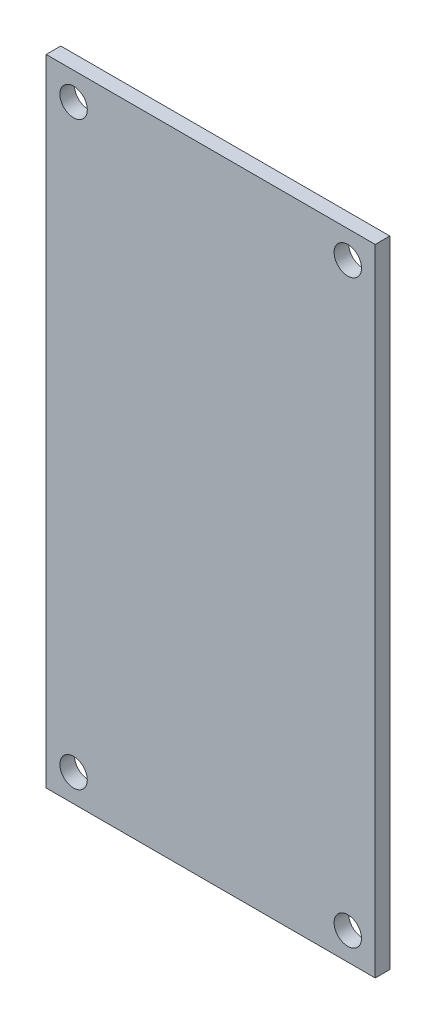
ISO-10303-21;
HEADER;
FILE_DESCRIPTION(('STEP AP214'),'2;1');
FILE_NAME('part.step','',(''),(''),'','','');
FILE_SCHEMA(('AUTOMOTIVE_DESIGN { 1 0 10303 214 1 1 1 1 }'));
ENDSEC;
DATA;
#1=APPLICATION_CONTEXT('core data for automotive mechanical design processes');
#2=APPLICATION_PROTOCOL_DEFINITION('international standard','automotive_design',2000,#1);
#3=PRODUCT_CONTEXT('',#1,'mechanical');
#4=PRODUCT('Part','Part','',(#3));
#5=PRODUCT_RELATED_PRODUCT_CATEGORY('part','',(#4));
#6=PRODUCT_DEFINITION_FORMATION('','',#4);
#7=PRODUCT_DEFINITION_CONTEXT('part definition',#1,'design');
#8=PRODUCT_DEFINITION('design','',#6,#7);
#9=PRODUCT_DEFINITION_SHAPE('','',#8);
#10=(LENGTH_UNIT() NAMED_UNIT(*) SI_UNIT(.MILLI.,.METRE.));
#11=(NAMED_UNIT(*) PLANE_ANGLE_UNIT() SI_UNIT($,.RADIAN.));
#12=(NAMED_UNIT(*) SI_UNIT($,.STERADIAN.) SOLID_ANGLE_UNIT());
#13=UNCERTAINTY_MEASURE_WITH_UNIT(LENGTH_MEASURE(1.E-05),#10,'distance_accuracy_value','');
#14=(GEOMETRIC_REPRESENTATION_CONTEXT(3) GLOBAL_UNCERTAINTY_ASSIGNED_CONTEXT((#13)) GLOBAL_UNIT_ASSIGNED_CONTEXT((#10,
#11,#12)) REPRESENTATION_CONTEXT('',''));
#15=CARTESIAN_POINT('',(0.,0.,0.));
#16=DIRECTION('',(0.,0.,1.));
#17=DIRECTION('',(1.,0.,0.));
#18=AXIS2_PLACEMENT_3D('',#15,#16,#17);
#19=CARTESIAN_POINT('',(0.,0.,1.6));
#20=DIRECTION('',(0.,0.,-1.));
#21=DIRECTION('',(-1.,0.,0.));
#22=AXIS2_PLACEMENT_3D('',#19,#20,#21);
#23=PLANE('',#22);
#24=DIRECTION('',(0.,-1.,0.));
#25=VECTOR('',#24,1.);
#26=CARTESIAN_POINT('',(0.,0.,1.6));
#27=LINE('',#26,#25);
#28=CARTESIAN_POINT('',(0.,69.5,1.6));
#29=VERTEX_POINT('',#28);
#30=CARTESIAN_POINT('',(0.,0.,1.6));
#31=VERTEX_POINT('',#30);
#32=EDGE_CURVE('E85',#29,#31,#27,.T.);
#33=ORIENTED_EDGE('',*,*,#32,.T.);
#34=DIRECTION('',(1.,0.,0.));
#35=VECTOR('',#34,1.);
#36=CARTESIAN_POINT('',(0.,0.,1.6));
#37=LINE('',#36,#35);
#38=CARTESIAN_POINT('',(36.,0.,1.6));
#39=VERTEX_POINT('',#38);
#40=EDGE_CURVE('E80',#31,#39,#37,.T.);
#41=ORIENTED_EDGE('',*,*,#40,.T.);
#42=DIRECTION('',(0.,1.,0.));
#43=VECTOR('',#42,1.);
#44=CARTESIAN_POINT('',(36.,0.,1.6));
#45=LINE('',#44,#43);
#46=CARTESIAN_POINT('',(36.,69.5,1.6));
#47=VERTEX_POINT('',#46);
#48=EDGE_CURVE('E83',#39,#47,#45,.T.);
#49=ORIENTED_EDGE('',*,*,#48,.T.);
#50=DIRECTION('',(-1.,0.,0.));
#51=VECTOR('',#50,1.);
#52=CARTESIAN_POINT('',(0.,69.5,1.6));
#53=LINE('',#52,#51);
#54=EDGE_CURVE('E50',#47,#29,#53,.T.);
#55=ORIENTED_EDGE('',*,*,#54,.T.);
#56=EDGE_LOOP('',(#33,#41,#49,#55));
#57=FACE_BOUND('',#56,.T.);
#58=CARTESIAN_POINT('',(3.,66.5,1.6));
#59=DIRECTION('',(0.,0.,1.));
#60=DIRECTION('',(1.,0.,0.));
#61=AXIS2_PLACEMENT_3D('',#58,#59,#60);
#62=CIRCLE('',#61,1.5);
#63=CARTESIAN_POINT('',(4.5,66.5,1.6));
#64=VERTEX_POINT('',#63);
#65=EDGE_CURVE('E100',#64,#64,#62,.T.);
#66=ORIENTED_EDGE('',*,*,#65,.F.);
#67=EDGE_LOOP('',(#66));
#68=FACE_BOUND('',#67,.T.);
#69=CARTESIAN_POINT('',(33.,66.5,1.6));
#70=DIRECTION('',(0.,0.,1.));
#71=DIRECTION('',(1.,0.,0.));
#72=AXIS2_PLACEMENT_3D('',#69,#70,#71);
#73=CIRCLE('',#72,1.5);
#74=CARTESIAN_POINT('',(34.5,66.5,1.6));
#75=VERTEX_POINT('',#74);
#76=EDGE_CURVE('E115',#75,#75,#73,.T.);
#77=ORIENTED_EDGE('',*,*,#76,.F.);
#78=EDGE_LOOP('',(#77));
#79=FACE_BOUND('',#78,.T.);
#80=CARTESIAN_POINT('',(33.,3.,1.6));
#81=DIRECTION('',(0.,0.,1.));
#82=DIRECTION('',(1.,0.,0.));
#83=AXIS2_PLACEMENT_3D('',#80,#81,#82);
#84=CIRCLE('',#83,1.5);
#85=CARTESIAN_POINT('',(34.5,3.,1.6));
#86=VERTEX_POINT('',#85);
#87=EDGE_CURVE('E121',#86,#86,#84,.T.);
#88=ORIENTED_EDGE('',*,*,#87,.F.);
#89=EDGE_LOOP('',(#88));
#90=FACE_BOUND('',#89,.T.);
#91=CARTESIAN_POINT('',(3.,3.,1.6));
#92=DIRECTION('',(0.,0.,1.));
#93=DIRECTION('',(1.,0.,0.));
#94=AXIS2_PLACEMENT_3D('',#91,#92,#93);
#95=CIRCLE('',#94,1.5);
#96=CARTESIAN_POINT('',(4.5,3.,1.6));
#97=VERTEX_POINT('',#96);
#98=EDGE_CURVE('E127',#97,#97,#95,.T.);
#99=ORIENTED_EDGE('',*,*,#98,.F.);
#100=EDGE_LOOP('',(#99));
#101=FACE_BOUND('',#100,.T.);
#102=ADVANCED_FACE('F33',(#57,#68,#79,#90,#101),#23,.F.);
#103=CARTESIAN_POINT('',(0.,0.,0.));
#104=DIRECTION('',(0.,0.,-1.));
#105=DIRECTION('',(-1.,0.,0.));
#106=AXIS2_PLACEMENT_3D('',#103,#104,#105);
#107=PLANE('',#106);
#108=CARTESIAN_POINT('',(33.,3.,0.));
#109=DIRECTION('',(0.,0.,1.));
#110=DIRECTION('',(1.,0.,0.));
#111=AXIS2_PLACEMENT_3D('',#108,#109,#110);
#112=CIRCLE('',#111,1.5);
#113=CARTESIAN_POINT('',(34.5,3.,0.));
#114=VERTEX_POINT('',#113);
#115=EDGE_CURVE('E124',#114,#114,#112,.T.);
#116=ORIENTED_EDGE('',*,*,#115,.T.);
#117=EDGE_LOOP('',(#116));
#118=FACE_BOUND('',#117,.T.);
#119=CARTESIAN_POINT('',(3.,66.5,0.));
#120=DIRECTION('',(0.,0.,1.));
#121=DIRECTION('',(1.,0.,0.));
#122=AXIS2_PLACEMENT_3D('',#119,#120,#121);
#123=CIRCLE('',#122,1.5);
#124=CARTESIAN_POINT('',(4.5,66.5,0.));
#125=VERTEX_POINT('',#124);
#126=EDGE_CURVE('E112',#125,#125,#123,.T.);
#127=ORIENTED_EDGE('',*,*,#126,.T.);
#128=EDGE_LOOP('',(#127));
#129=FACE_BOUND('',#128,.T.);
#130=DIRECTION('',(0.,-1.,0.));
#131=VECTOR('',#130,1.);
#132=CARTESIAN_POINT('',(0.,0.,0.));
#133=LINE('',#132,#131);
#134=CARTESIAN_POINT('',(0.,69.5,0.));
#135=VERTEX_POINT('',#134);
#136=CARTESIAN_POINT('',(0.,0.,0.));
#137=VERTEX_POINT('',#136);
#138=EDGE_CURVE('E97',#135,#137,#133,.T.);
#139=ORIENTED_EDGE('',*,*,#138,.F.);
#140=DIRECTION('',(-1.,0.,0.));
#141=VECTOR('',#140,1.);
#142=CARTESIAN_POINT('',(0.,69.5,0.));
#143=LINE('',#142,#141);
#144=CARTESIAN_POINT('',(36.,69.5,0.));
#145=VERTEX_POINT('',#144);
#146=EDGE_CURVE('E73',#145,#135,#143,.T.);
#147=ORIENTED_EDGE('',*,*,#146,.F.);
#148=DIRECTION('',(0.,1.,0.));
#149=VECTOR('',#148,1.);
#150=CARTESIAN_POINT('',(36.,0.,0.));
#151=LINE('',#150,#149);
#152=CARTESIAN_POINT('',(36.,0.,0.));
#153=VERTEX_POINT('',#152);
#154=EDGE_CURVE('E67',#153,#145,#151,.T.);
#155=ORIENTED_EDGE('',*,*,#154,.F.);
#156=DIRECTION('',(1.,0.,0.));
#157=VECTOR('',#156,1.);
#158=CARTESIAN_POINT('',(0.,0.,0.));
#159=LINE('',#158,#157);
#160=EDGE_CURVE('E89',#137,#153,#159,.T.);
#161=ORIENTED_EDGE('',*,*,#160,.F.);
#162=EDGE_LOOP('',(#139,#147,#155,#161));
#163=FACE_BOUND('',#162,.T.);
#164=CARTESIAN_POINT('',(33.,66.5,0.));
#165=DIRECTION('',(0.,0.,1.));
#166=DIRECTION('',(1.,0.,0.));
#167=AXIS2_PLACEMENT_3D('',#164,#165,#166);
#168=CIRCLE('',#167,1.5);
#169=CARTESIAN_POINT('',(34.5,66.5,0.));
#170=VERTEX_POINT('',#169);
#171=EDGE_CURVE('E118',#170,#170,#168,.T.);
#172=ORIENTED_EDGE('',*,*,#171,.T.);
#173=EDGE_LOOP('',(#172));
#174=FACE_BOUND('',#173,.T.);
#175=CARTESIAN_POINT('',(3.,3.,0.));
#176=DIRECTION('',(0.,0.,1.));
#177=DIRECTION('',(1.,0.,0.));
#178=AXIS2_PLACEMENT_3D('',#175,#176,#177);
#179=CIRCLE('',#178,1.5);
#180=CARTESIAN_POINT('',(4.5,3.,0.));
#181=VERTEX_POINT('',#180);
#182=EDGE_CURVE('E130',#181,#181,#179,.T.);
#183=ORIENTED_EDGE('',*,*,#182,.T.);
#184=EDGE_LOOP('',(#183));
#185=FACE_BOUND('',#184,.T.);
#186=ADVANCED_FACE('F108',(#118,#129,#163,#174,#185),#107,.T.);
#187=CARTESIAN_POINT('',(0.,0.,1.6));
#188=DIRECTION('',(1.,0.,0.));
#189=DIRECTION('',(0.,0.,-1.));
#190=AXIS2_PLACEMENT_3D('',#187,#188,#189);
#191=PLANE('',#190);
#192=ORIENTED_EDGE('',*,*,#138,.T.);
#193=DIRECTION('',(0.,0.,-1.));
#194=VECTOR('',#193,1.);
#195=CARTESIAN_POINT('',(0.,0.,1.6));
#196=LINE('',#195,#194);
#197=EDGE_CURVE('E11',#31,#137,#196,.T.);
#198=ORIENTED_EDGE('',*,*,#197,.F.);
#199=ORIENTED_EDGE('',*,*,#32,.F.);
#200=DIRECTION('',(0.,0.,-1.));
#201=VECTOR('',#200,1.);
#202=CARTESIAN_POINT('',(0.,69.5,1.6));
#203=LINE('',#202,#201);
#204=EDGE_CURVE('E93',#29,#135,#203,.T.);
#205=ORIENTED_EDGE('',*,*,#204,.T.);
#206=EDGE_LOOP('',(#192,#198,#199,#205));
#207=FACE_BOUND('',#206,.T.);
#208=ADVANCED_FACE('F35',(#207),#191,.F.);
#209=CARTESIAN_POINT('',(0.,0.,1.6));
#210=DIRECTION('',(0.,1.,0.));
#211=DIRECTION('',(0.,0.,1.));
#212=AXIS2_PLACEMENT_3D('',#209,#210,#211);
#213=PLANE('',#212);
#214=ORIENTED_EDGE('',*,*,#160,.T.);
#215=DIRECTION('',(0.,0.,-1.));
#216=VECTOR('',#215,1.);
#217=CARTESIAN_POINT('',(36.,0.,1.6));
#218=LINE('',#217,#216);
#219=EDGE_CURVE('E42',#39,#153,#218,.T.);
#220=ORIENTED_EDGE('',*,*,#219,.F.);
#221=ORIENTED_EDGE('',*,*,#40,.F.);
#222=ORIENTED_EDGE('',*,*,#197,.T.);
#223=EDGE_LOOP('',(#214,#220,#221,#222));
#224=FACE_BOUND('',#223,.T.);
#225=ADVANCED_FACE('F88',(#224),#213,.F.);
#226=CARTESIAN_POINT('',(36.,0.,1.6));
#227=DIRECTION('',(-1.,0.,0.));
#228=DIRECTION('',(0.,0.,1.));
#229=AXIS2_PLACEMENT_3D('',#226,#227,#228);
#230=PLANE('',#229);
#231=ORIENTED_EDGE('',*,*,#154,.T.);
#232=DIRECTION('',(0.,0.,-1.));
#233=VECTOR('',#232,1.);
#234=CARTESIAN_POINT('',(36.,69.5,1.6));
#235=LINE('',#234,#233);
#236=EDGE_CURVE('E90',#47,#145,#235,.T.);
#237=ORIENTED_EDGE('',*,*,#236,.F.);
#238=ORIENTED_EDGE('',*,*,#48,.F.);
#239=ORIENTED_EDGE('',*,*,#219,.T.);
#240=EDGE_LOOP('',(#231,#237,#238,#239));
#241=FACE_BOUND('',#240,.T.);
#242=ADVANCED_FACE('F91',(#241),#230,.F.);
#243=CARTESIAN_POINT('',(0.,69.5,1.6));
#244=DIRECTION('',(0.,-1.,0.));
#245=DIRECTION('',(0.,0.,-1.));
#246=AXIS2_PLACEMENT_3D('',#243,#244,#245);
#247=PLANE('',#246);
#248=ORIENTED_EDGE('',*,*,#146,.T.);
#249=ORIENTED_EDGE('',*,*,#204,.F.);
#250=ORIENTED_EDGE('',*,*,#54,.F.);
#251=ORIENTED_EDGE('',*,*,#236,.T.);
#252=EDGE_LOOP('',(#248,#249,#250,#251));
#253=FACE_BOUND('',#252,.T.);
#254=ADVANCED_FACE('F105',(#253),#247,.F.);
#255=CARTESIAN_POINT('',(3.,66.5,1.6));
#256=DIRECTION('',(0.,0.,-1.));
#257=DIRECTION('',(-1.,0.,0.));
#258=AXIS2_PLACEMENT_3D('',#255,#256,#257);
#259=CYLINDRICAL_SURFACE('',#258,1.5);
#260=ORIENTED_EDGE('',*,*,#65,.T.);
#261=EDGE_LOOP('',(#260));
#262=FACE_BOUND('',#261,.T.);
#263=ORIENTED_EDGE('',*,*,#126,.F.);
#264=EDGE_LOOP('',(#263));
#265=FACE_BOUND('',#264,.T.);
#266=ADVANCED_FACE('F147',(#262,#265),#259,.F.);
#267=CARTESIAN_POINT('',(33.,66.5,1.6));
#268=DIRECTION('',(0.,0.,-1.));
#269=DIRECTION('',(-1.,0.,0.));
#270=AXIS2_PLACEMENT_3D('',#267,#268,#269);
#271=CYLINDRICAL_SURFACE('',#270,1.5);
#272=ORIENTED_EDGE('',*,*,#76,.T.);
#273=EDGE_LOOP('',(#272));
#274=FACE_BOUND('',#273,.T.);
#275=ORIENTED_EDGE('',*,*,#171,.F.);
#276=EDGE_LOOP('',(#275));
#277=FACE_BOUND('',#276,.T.);
#278=ADVANCED_FACE('F193',(#274,#277),#271,.F.);
#279=CARTESIAN_POINT('',(33.,3.,1.6));
#280=DIRECTION('',(0.,0.,-1.));
#281=DIRECTION('',(-1.,0.,0.));
#282=AXIS2_PLACEMENT_3D('',#279,#280,#281);
#283=CYLINDRICAL_SURFACE('',#282,1.5);
#284=ORIENTED_EDGE('',*,*,#87,.T.);
#285=EDGE_LOOP('',(#284));
#286=FACE_BOUND('',#285,.T.);
#287=ORIENTED_EDGE('',*,*,#115,.F.);
#288=EDGE_LOOP('',(#287));
#289=FACE_BOUND('',#288,.T.);
#290=ADVANCED_FACE('F201',(#286,#289),#283,.F.);
#291=CARTESIAN_POINT('',(3.,3.,1.6));
#292=DIRECTION('',(0.,0.,-1.));
#293=DIRECTION('',(-1.,0.,0.));
#294=AXIS2_PLACEMENT_3D('',#291,#292,#293);
#295=CYLINDRICAL_SURFACE('',#294,1.5);
#296=ORIENTED_EDGE('',*,*,#98,.T.);
#297=EDGE_LOOP('',(#296));
#298=FACE_BOUND('',#297,.T.);
#299=ORIENTED_EDGE('',*,*,#182,.F.);
#300=EDGE_LOOP('',(#299));
#301=FACE_BOUND('',#300,.T.);
#302=ADVANCED_FACE('F136',(#298,#301),#295,.F.);
#303=CLOSED_SHELL('',(#102,#186,#208,#225,#242,#254,#266,#278,#290,#302));
#304=MANIFOLD_SOLID_BREP('B2',#303);
#305=ADVANCED_BREP_SHAPE_REPRESENTATION('',(#18,#304),#14);
#306=SHAPE_DEFINITION_REPRESENTATION(#9,#305);
ENDSEC;
END-ISO-10303-21;
